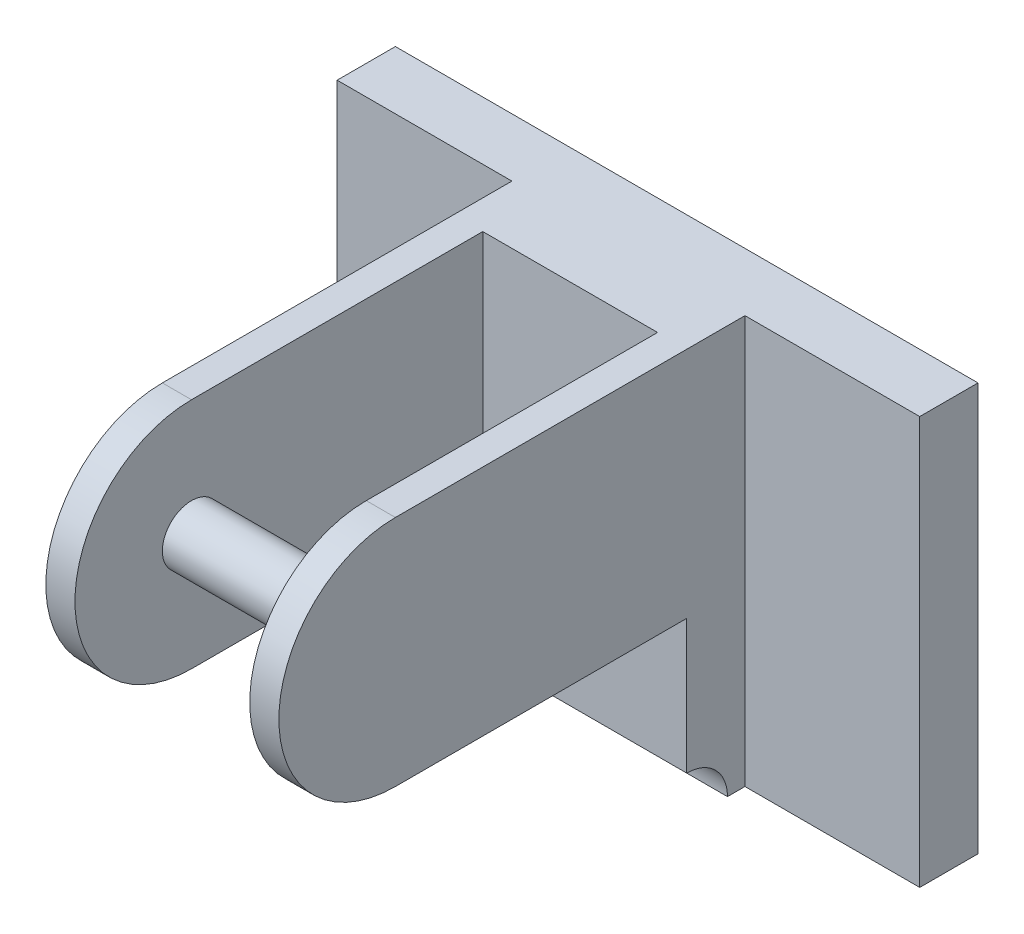
ISO-10303-21;
HEADER;
FILE_DESCRIPTION(('STEP AP214'),'2;1');
FILE_NAME('part.step','',(''),(''),'','','');
FILE_SCHEMA(('AUTOMOTIVE_DESIGN { 1 0 10303 214 1 1 1 1 }'));
ENDSEC;
DATA;
#1=APPLICATION_CONTEXT('core data for automotive mechanical design processes');
#2=APPLICATION_PROTOCOL_DEFINITION('international standard','automotive_design',2000,#1);
#3=PRODUCT_CONTEXT('',#1,'mechanical');
#4=PRODUCT('Part','Part','',(#3));
#5=PRODUCT_RELATED_PRODUCT_CATEGORY('part','',(#4));
#6=PRODUCT_DEFINITION_FORMATION('','',#4);
#7=PRODUCT_DEFINITION_CONTEXT('part definition',#1,'design');
#8=PRODUCT_DEFINITION('design','',#6,#7);
#9=PRODUCT_DEFINITION_SHAPE('','',#8);
#10=(LENGTH_UNIT() NAMED_UNIT(*) SI_UNIT(.MILLI.,.METRE.));
#11=(NAMED_UNIT(*) PLANE_ANGLE_UNIT() SI_UNIT($,.RADIAN.));
#12=(NAMED_UNIT(*) SI_UNIT($,.STERADIAN.) SOLID_ANGLE_UNIT());
#13=UNCERTAINTY_MEASURE_WITH_UNIT(LENGTH_MEASURE(1.E-05),#10,'distance_accuracy_value','');
#14=(GEOMETRIC_REPRESENTATION_CONTEXT(3) GLOBAL_UNCERTAINTY_ASSIGNED_CONTEXT((#13)) GLOBAL_UNIT_ASSIGNED_CONTEXT((#10,
#11,#12)) REPRESENTATION_CONTEXT('',''));
#15=CARTESIAN_POINT('',(0.,0.,0.));
#16=DIRECTION('',(0.,0.,1.));
#17=DIRECTION('',(1.,0.,0.));
#18=AXIS2_PLACEMENT_3D('',#15,#16,#17);
#19=CARTESIAN_POINT('',(0.,0.,10.));
#20=DIRECTION('',(0.,0.,-1.));
#21=DIRECTION('',(-1.,0.,0.));
#22=AXIS2_PLACEMENT_3D('',#19,#20,#21);
#23=PLANE('',#22);
#24=DIRECTION('',(0.,-1.,0.));
#25=VECTOR('',#24,1.);
#26=CARTESIAN_POINT('',(-20.,-35.,10.));
#27=LINE('',#26,#25);
#28=CARTESIAN_POINT('',(-20.,35.,10.));
#29=VERTEX_POINT('',#28);
#30=CARTESIAN_POINT('',(-20.,-35.,10.));
#31=VERTEX_POINT('',#30);
#32=EDGE_CURVE('E203',#29,#31,#27,.T.);
#33=ORIENTED_EDGE('',*,*,#32,.F.);
#34=DIRECTION('',(-1.,0.,0.));
#35=VECTOR('',#34,1.);
#36=CARTESIAN_POINT('',(50.,35.,10.));
#37=LINE('',#36,#35);
#38=CARTESIAN_POINT('',(-50.,35.,10.));
#39=VERTEX_POINT('',#38);
#40=EDGE_CURVE('E235',#29,#39,#37,.T.);
#41=ORIENTED_EDGE('',*,*,#40,.T.);
#42=DIRECTION('',(0.,-1.,0.));
#43=VECTOR('',#42,1.);
#44=CARTESIAN_POINT('',(-50.,35.,10.));
#45=LINE('',#44,#43);
#46=CARTESIAN_POINT('',(-50.,-35.,10.));
#47=VERTEX_POINT('',#46);
#48=EDGE_CURVE('E225',#39,#47,#45,.T.);
#49=ORIENTED_EDGE('',*,*,#48,.T.);
#50=DIRECTION('',(1.,0.,0.));
#51=VECTOR('',#50,1.);
#52=CARTESIAN_POINT('',(50.,-35.,10.));
#53=LINE('',#52,#51);
#54=EDGE_CURVE('E230',#47,#31,#53,.T.);
#55=ORIENTED_EDGE('',*,*,#54,.T.);
#56=EDGE_LOOP('',(#33,#41,#49,#55));
#57=FACE_BOUND('',#56,.T.);
#58=ADVANCED_FACE('F33',(#57),#23,.F.);
#59=DIRECTION('',(0.,1.,0.));
#60=VECTOR('',#59,1.);
#61=CARTESIAN_POINT('',(20.,-35.,10.));
#62=LINE('',#61,#60);
#63=CARTESIAN_POINT('',(20.,-35.,10.));
#64=VERTEX_POINT('',#63);
#65=CARTESIAN_POINT('',(20.,35.,10.));
#66=VERTEX_POINT('',#65);
#67=EDGE_CURVE('E207',#64,#66,#62,.T.);
#68=ORIENTED_EDGE('',*,*,#67,.F.);
#69=CARTESIAN_POINT('',(50.,-35.,10.));
#70=VERTEX_POINT('',#69);
#71=EDGE_CURVE('E228',#64,#70,#53,.T.);
#72=ORIENTED_EDGE('',*,*,#71,.T.);
#73=DIRECTION('',(0.,1.,0.));
#74=VECTOR('',#73,1.);
#75=CARTESIAN_POINT('',(50.,35.,10.));
#76=LINE('',#75,#74);
#77=CARTESIAN_POINT('',(50.,35.,10.));
#78=VERTEX_POINT('',#77);
#79=EDGE_CURVE('E233',#70,#78,#76,.T.);
#80=ORIENTED_EDGE('',*,*,#79,.T.);
#81=EDGE_CURVE('E236',#78,#66,#37,.T.);
#82=ORIENTED_EDGE('',*,*,#81,.T.);
#83=EDGE_LOOP('',(#68,#72,#80,#82));
#84=FACE_BOUND('',#83,.T.);
#85=ADVANCED_FACE('F274',(#84),#23,.F.);
#86=CARTESIAN_POINT('',(-50.,35.,10.));
#87=DIRECTION('',(1.,0.,0.));
#88=DIRECTION('',(0.,1.,0.));
#89=AXIS2_PLACEMENT_3D('',#86,#87,#88);
#90=PLANE('',#89);
#91=DIRECTION('',(0.,-1.,0.));
#92=VECTOR('',#91,1.);
#93=CARTESIAN_POINT('',(-50.,35.,0.));
#94=LINE('',#93,#92);
#95=CARTESIAN_POINT('',(-50.,35.,0.));
#96=VERTEX_POINT('',#95);
#97=CARTESIAN_POINT('',(-50.,-35.,0.));
#98=VERTEX_POINT('',#97);
#99=EDGE_CURVE('E224',#96,#98,#94,.T.);
#100=ORIENTED_EDGE('',*,*,#99,.T.);
#101=DIRECTION('',(0.,0.,-1.));
#102=VECTOR('',#101,1.);
#103=CARTESIAN_POINT('',(-50.,-35.,10.));
#104=LINE('',#103,#102);
#105=EDGE_CURVE('E254',#47,#98,#104,.T.);
#106=ORIENTED_EDGE('',*,*,#105,.F.);
#107=ORIENTED_EDGE('',*,*,#48,.F.);
#108=DIRECTION('',(0.,0.,-1.));
#109=VECTOR('',#108,1.);
#110=CARTESIAN_POINT('',(-50.,35.,10.));
#111=LINE('',#110,#109);
#112=EDGE_CURVE('E238',#39,#96,#111,.T.);
#113=ORIENTED_EDGE('',*,*,#112,.T.);
#114=EDGE_LOOP('',(#100,#106,#107,#113));
#115=FACE_BOUND('',#114,.T.);
#116=ADVANCED_FACE('F35',(#115),#90,.F.);
#117=CARTESIAN_POINT('',(50.,-35.,10.));
#118=DIRECTION('',(0.,1.,0.));
#119=DIRECTION('',(-1.,0.,0.));
#120=AXIS2_PLACEMENT_3D('',#117,#118,#119);
#121=PLANE('',#120);
#122=DIRECTION('',(0.,0.,-1.));
#123=VECTOR('',#122,1.);
#124=CARTESIAN_POINT('',(20.,-35.,20.));
#125=LINE('',#124,#123);
#126=CARTESIAN_POINT('',(20.,-35.,13.));
#127=VERTEX_POINT('',#126);
#128=EDGE_CURVE('E220',#127,#64,#125,.T.);
#129=ORIENTED_EDGE('',*,*,#128,.F.);
#130=DIRECTION('',(1.,0.,0.));
#131=VECTOR('',#130,1.);
#132=CARTESIAN_POINT('',(-50.,-35.,13.));
#133=LINE('',#132,#131);
#134=CARTESIAN_POINT('',(-20.,-35.,13.));
#135=VERTEX_POINT('',#134);
#136=EDGE_CURVE('E198',#135,#127,#133,.T.);
#137=ORIENTED_EDGE('',*,*,#136,.F.);
#138=DIRECTION('',(0.,0.,-1.));
#139=VECTOR('',#138,1.);
#140=CARTESIAN_POINT('',(-20.,-35.,20.));
#141=LINE('',#140,#139);
#142=EDGE_CURVE('E222',#135,#31,#141,.T.);
#143=ORIENTED_EDGE('',*,*,#142,.T.);
#144=ORIENTED_EDGE('',*,*,#54,.F.);
#145=ORIENTED_EDGE('',*,*,#105,.T.);
#146=DIRECTION('',(1.,0.,0.));
#147=VECTOR('',#146,1.);
#148=CARTESIAN_POINT('',(50.,-35.,0.));
#149=LINE('',#148,#147);
#150=CARTESIAN_POINT('',(50.,-35.,0.));
#151=VERTEX_POINT('',#150);
#152=EDGE_CURVE('E241',#98,#151,#149,.T.);
#153=ORIENTED_EDGE('',*,*,#152,.T.);
#154=DIRECTION('',(0.,0.,-1.));
#155=VECTOR('',#154,1.);
#156=CARTESIAN_POINT('',(50.,-35.,10.));
#157=LINE('',#156,#155);
#158=EDGE_CURVE('E251',#70,#151,#157,.T.);
#159=ORIENTED_EDGE('',*,*,#158,.F.);
#160=ORIENTED_EDGE('',*,*,#71,.F.);
#161=EDGE_LOOP('',(#129,#137,#143,#144,#145,#153,#159,#160));
#162=FACE_BOUND('',#161,.T.);
#163=ADVANCED_FACE('F295',(#162),#121,.F.);
#164=CARTESIAN_POINT('',(50.,35.,10.));
#165=DIRECTION('',(-1.,0.,0.));
#166=DIRECTION('',(0.,-1.,0.));
#167=AXIS2_PLACEMENT_3D('',#164,#165,#166);
#168=PLANE('',#167);
#169=DIRECTION('',(0.,1.,0.));
#170=VECTOR('',#169,1.);
#171=CARTESIAN_POINT('',(50.,35.,0.));
#172=LINE('',#171,#170);
#173=CARTESIAN_POINT('',(50.,35.,0.));
#174=VERTEX_POINT('',#173);
#175=EDGE_CURVE('E243',#151,#174,#172,.T.);
#176=ORIENTED_EDGE('',*,*,#175,.T.);
#177=DIRECTION('',(0.,0.,-1.));
#178=VECTOR('',#177,1.);
#179=CARTESIAN_POINT('',(50.,35.,10.));
#180=LINE('',#179,#178);
#181=EDGE_CURVE('E248',#78,#174,#180,.T.);
#182=ORIENTED_EDGE('',*,*,#181,.F.);
#183=ORIENTED_EDGE('',*,*,#79,.F.);
#184=ORIENTED_EDGE('',*,*,#158,.T.);
#185=EDGE_LOOP('',(#176,#182,#183,#184));
#186=FACE_BOUND('',#185,.T.);
#187=ADVANCED_FACE('F292',(#186),#168,.F.);
#188=CARTESIAN_POINT('',(50.,35.,10.));
#189=DIRECTION('',(0.,-1.,0.));
#190=DIRECTION('',(1.,0.,0.));
#191=AXIS2_PLACEMENT_3D('',#188,#189,#190);
#192=PLANE('',#191);
#193=DIRECTION('',(-1.,0.,0.));
#194=VECTOR('',#193,1.);
#195=CARTESIAN_POINT('',(50.,35.,0.));
#196=LINE('',#195,#194);
#197=EDGE_CURVE('E229',#174,#96,#196,.T.);
#198=ORIENTED_EDGE('',*,*,#197,.T.);
#199=ORIENTED_EDGE('',*,*,#112,.F.);
#200=ORIENTED_EDGE('',*,*,#40,.F.);
#201=DIRECTION('',(0.,0.,-1.));
#202=VECTOR('',#201,1.);
#203=CARTESIAN_POINT('',(-20.,35.,20.));
#204=LINE('',#203,#202);
#205=CARTESIAN_POINT('',(-20.,35.,70.));
#206=VERTEX_POINT('',#205);
#207=EDGE_CURVE('E210',#206,#29,#204,.T.);
#208=ORIENTED_EDGE('',*,*,#207,.F.);
#209=DIRECTION('',(-1.,0.,0.));
#210=VECTOR('',#209,1.);
#211=CARTESIAN_POINT('',(-15.,35.,70.));
#212=LINE('',#211,#210);
#213=CARTESIAN_POINT('',(-15.,35.,70.));
#214=VERTEX_POINT('',#213);
#215=EDGE_CURVE('E150',#214,#206,#212,.T.);
#216=ORIENTED_EDGE('',*,*,#215,.F.);
#217=DIRECTION('',(0.,0.,1.));
#218=VECTOR('',#217,1.);
#219=CARTESIAN_POINT('',(-15.,35.,0.));
#220=LINE('',#219,#218);
#221=CARTESIAN_POINT('',(-15.,35.,20.));
#222=VERTEX_POINT('',#221);
#223=EDGE_CURVE('E157',#222,#214,#220,.T.);
#224=ORIENTED_EDGE('',*,*,#223,.F.);
#225=DIRECTION('',(-1.,0.,0.));
#226=VECTOR('',#225,1.);
#227=CARTESIAN_POINT('',(20.,35.,20.));
#228=LINE('',#227,#226);
#229=CARTESIAN_POINT('',(15.,35.,20.));
#230=VERTEX_POINT('',#229);
#231=EDGE_CURVE('E53',#230,#222,#228,.T.);
#232=ORIENTED_EDGE('',*,*,#231,.F.);
#233=DIRECTION('',(0.,0.,1.));
#234=VECTOR('',#233,1.);
#235=CARTESIAN_POINT('',(15.,35.,0.));
#236=LINE('',#235,#234);
#237=CARTESIAN_POINT('',(15.,35.,70.));
#238=VERTEX_POINT('',#237);
#239=EDGE_CURVE('E172',#230,#238,#236,.T.);
#240=ORIENTED_EDGE('',*,*,#239,.T.);
#241=DIRECTION('',(1.,0.,0.));
#242=VECTOR('',#241,1.);
#243=CARTESIAN_POINT('',(15.,35.,70.));
#244=LINE('',#243,#242);
#245=CARTESIAN_POINT('',(20.,35.,70.));
#246=VERTEX_POINT('',#245);
#247=EDGE_CURVE('E184',#238,#246,#244,.T.);
#248=ORIENTED_EDGE('',*,*,#247,.T.);
#249=DIRECTION('',(0.,0.,-1.));
#250=VECTOR('',#249,1.);
#251=CARTESIAN_POINT('',(20.,35.,20.));
#252=LINE('',#251,#250);
#253=EDGE_CURVE('E217',#246,#66,#252,.T.);
#254=ORIENTED_EDGE('',*,*,#253,.T.);
#255=ORIENTED_EDGE('',*,*,#81,.F.);
#256=ORIENTED_EDGE('',*,*,#181,.T.);
#257=EDGE_LOOP('',(#198,#199,#200,#208,#216,#224,#232,#240,#248,#254,#255,#256));
#258=FACE_BOUND('',#257,.T.);
#259=ADVANCED_FACE('F288',(#258),#192,.F.);
#260=CARTESIAN_POINT('',(0.,0.,0.));
#261=DIRECTION('',(0.,0.,-1.));
#262=DIRECTION('',(-1.,0.,0.));
#263=AXIS2_PLACEMENT_3D('',#260,#261,#262);
#264=PLANE('',#263);
#265=ORIENTED_EDGE('',*,*,#99,.F.);
#266=ORIENTED_EDGE('',*,*,#197,.F.);
#267=ORIENTED_EDGE('',*,*,#175,.F.);
#268=ORIENTED_EDGE('',*,*,#152,.F.);
#269=EDGE_LOOP('',(#265,#266,#267,#268));
#270=FACE_BOUND('',#269,.T.);
#271=ADVANCED_FACE('F285',(#270),#264,.T.);
#272=CARTESIAN_POINT('',(-20.,-35.,20.));
#273=DIRECTION('',(1.,0.,0.));
#274=DIRECTION('',(0.,0.,-1.));
#275=AXIS2_PLACEMENT_3D('',#272,#273,#274);
#276=PLANE('',#275);
#277=ORIENTED_EDGE('',*,*,#142,.F.);
#278=CARTESIAN_POINT('',(-20.,-35.,20.));
#279=DIRECTION('',(1.,0.,0.));
#280=DIRECTION('',(0.,0.,-1.));
#281=AXIS2_PLACEMENT_3D('',#278,#279,#280);
#282=CIRCLE('',#281,7.);
#283=CARTESIAN_POINT('',(-20.,-28.,20.));
#284=VERTEX_POINT('',#283);
#285=EDGE_CURVE('E200',#135,#284,#282,.T.);
#286=ORIENTED_EDGE('',*,*,#285,.T.);
#287=DIRECTION('',(0.,-1.,0.));
#288=VECTOR('',#287,1.);
#289=CARTESIAN_POINT('',(-20.,-35.,20.));
#290=LINE('',#289,#288);
#291=CARTESIAN_POINT('',(-20.,-4.99999999999999,20.));
#292=VERTEX_POINT('',#291);
#293=EDGE_CURVE('E204',#292,#284,#290,.T.);
#294=ORIENTED_EDGE('',*,*,#293,.F.);
#295=DIRECTION('',(0.,0.,1.));
#296=VECTOR('',#295,1.);
#297=CARTESIAN_POINT('',(-20.,-4.99999999999999,0.));
#298=LINE('',#297,#296);
#299=CARTESIAN_POINT('',(-20.,-4.99999999999999,70.));
#300=VERTEX_POINT('',#299);
#301=EDGE_CURVE('E163',#292,#300,#298,.T.);
#302=ORIENTED_EDGE('',*,*,#301,.T.);
#303=CARTESIAN_POINT('',(-20.,15.,70.));
#304=DIRECTION('',(-1.,0.,0.));
#305=DIRECTION('',(0.,0.,1.));
#306=AXIS2_PLACEMENT_3D('',#303,#304,#305);
#307=CIRCLE('',#306,20.);
#308=EDGE_CURVE('E145',#300,#206,#307,.T.);
#309=ORIENTED_EDGE('',*,*,#308,.T.);
#310=ORIENTED_EDGE('',*,*,#207,.T.);
#311=ORIENTED_EDGE('',*,*,#32,.T.);
#312=EDGE_LOOP('',(#277,#286,#294,#302,#309,#310,#311));
#313=FACE_BOUND('',#312,.T.);
#314=ADVANCED_FACE('F283',(#313),#276,.F.);
#315=CARTESIAN_POINT('',(20.,-35.,20.));
#316=DIRECTION('',(-1.,0.,0.));
#317=DIRECTION('',(0.,0.,1.));
#318=AXIS2_PLACEMENT_3D('',#315,#316,#317);
#319=PLANE('',#318);
#320=DIRECTION('',(0.,1.,0.));
#321=VECTOR('',#320,1.);
#322=CARTESIAN_POINT('',(20.,-35.,20.));
#323=LINE('',#322,#321);
#324=CARTESIAN_POINT('',(20.,-28.,20.));
#325=VERTEX_POINT('',#324);
#326=CARTESIAN_POINT('',(20.,-4.99999999999999,20.));
#327=VERTEX_POINT('',#326);
#328=EDGE_CURVE('E206',#325,#327,#323,.T.);
#329=ORIENTED_EDGE('',*,*,#328,.F.);
#330=CARTESIAN_POINT('',(20.,-35.,20.));
#331=DIRECTION('',(1.,0.,0.));
#332=DIRECTION('',(0.,0.,1.));
#333=AXIS2_PLACEMENT_3D('',#330,#331,#332);
#334=CIRCLE('',#333,7.);
#335=EDGE_CURVE('E192',#127,#325,#334,.T.);
#336=ORIENTED_EDGE('',*,*,#335,.F.);
#337=ORIENTED_EDGE('',*,*,#128,.T.);
#338=ORIENTED_EDGE('',*,*,#67,.T.);
#339=ORIENTED_EDGE('',*,*,#253,.F.);
#340=CARTESIAN_POINT('',(20.,15.,70.));
#341=DIRECTION('',(1.,0.,0.));
#342=DIRECTION('',(0.,0.,-1.));
#343=AXIS2_PLACEMENT_3D('',#340,#341,#342);
#344=CIRCLE('',#343,20.);
#345=CARTESIAN_POINT('',(20.,-5.,70.));
#346=VERTEX_POINT('',#345);
#347=EDGE_CURVE('E170',#246,#346,#344,.T.);
#348=ORIENTED_EDGE('',*,*,#347,.T.);
#349=DIRECTION('',(0.,0.,1.));
#350=VECTOR('',#349,1.);
#351=CARTESIAN_POINT('',(20.,-4.99999999999999,0.));
#352=LINE('',#351,#350);
#353=EDGE_CURVE('E176',#327,#346,#352,.T.);
#354=ORIENTED_EDGE('',*,*,#353,.F.);
#355=EDGE_LOOP('',(#329,#336,#337,#338,#339,#348,#354));
#356=FACE_BOUND('',#355,.T.);
#357=ADVANCED_FACE('F312',(#356),#319,.F.);
#358=CARTESIAN_POINT('',(0.,0.,20.));
#359=DIRECTION('',(0.,0.,1.));
#360=DIRECTION('',(1.,0.,0.));
#361=AXIS2_PLACEMENT_3D('',#358,#359,#360);
#362=PLANE('',#361);
#363=DIRECTION('',(-1.,0.,0.));
#364=VECTOR('',#363,1.);
#365=CARTESIAN_POINT('',(-15.,-4.99999999999999,20.));
#366=LINE('',#365,#364);
#367=CARTESIAN_POINT('',(-15.,-4.99999999999999,20.));
#368=VERTEX_POINT('',#367);
#369=EDGE_CURVE('E161',#368,#292,#366,.T.);
#370=ORIENTED_EDGE('',*,*,#369,.T.);
#371=ORIENTED_EDGE('',*,*,#293,.T.);
#372=DIRECTION('',(1.,0.,0.));
#373=VECTOR('',#372,1.);
#374=CARTESIAN_POINT('',(-50.,-28.,20.));
#375=LINE('',#374,#373);
#376=EDGE_CURVE('E257',#325,#284,#375,.F.);
#377=ORIENTED_EDGE('',*,*,#376,.F.);
#378=ORIENTED_EDGE('',*,*,#328,.T.);
#379=DIRECTION('',(1.,0.,0.));
#380=VECTOR('',#379,1.);
#381=CARTESIAN_POINT('',(15.,-4.99999999999999,20.));
#382=LINE('',#381,#380);
#383=CARTESIAN_POINT('',(15.,-4.99999999999999,20.));
#384=VERTEX_POINT('',#383);
#385=EDGE_CURVE('E189',#384,#327,#382,.T.);
#386=ORIENTED_EDGE('',*,*,#385,.F.);
#387=DIRECTION('',(0.,-1.,0.));
#388=VECTOR('',#387,1.);
#389=CARTESIAN_POINT('',(15.,0.,20.));
#390=LINE('',#389,#388);
#391=EDGE_CURVE('E181',#230,#384,#390,.T.);
#392=ORIENTED_EDGE('',*,*,#391,.F.);
#393=ORIENTED_EDGE('',*,*,#231,.T.);
#394=DIRECTION('',(0.,1.,0.));
#395=VECTOR('',#394,1.);
#396=CARTESIAN_POINT('',(-15.,0.,20.));
#397=LINE('',#396,#395);
#398=EDGE_CURVE('E48',#368,#222,#397,.T.);
#399=ORIENTED_EDGE('',*,*,#398,.F.);
#400=EDGE_LOOP('',(#370,#371,#377,#378,#386,#392,#393,#399));
#401=FACE_BOUND('',#400,.T.);
#402=ADVANCED_FACE('F326',(#401),#362,.T.);
#403=CARTESIAN_POINT('',(-50.,-35.,20.));
#404=DIRECTION('',(1.,0.,0.));
#405=DIRECTION('',(0.,0.,-1.));
#406=AXIS2_PLACEMENT_3D('',#403,#404,#405);
#407=CYLINDRICAL_SURFACE('',#406,7.);
#408=ORIENTED_EDGE('',*,*,#136,.T.);
#409=ORIENTED_EDGE('',*,*,#335,.T.);
#410=ORIENTED_EDGE('',*,*,#376,.T.);
#411=ORIENTED_EDGE('',*,*,#285,.F.);
#412=EDGE_LOOP('',(#408,#409,#410,#411));
#413=FACE_BOUND('',#412,.T.);
#414=ADVANCED_FACE('F334',(#413),#407,.F.);
#415=CARTESIAN_POINT('',(15.,-4.99999999999999,0.));
#416=DIRECTION('',(0.,1.,0.));
#417=DIRECTION('',(0.,0.,1.));
#418=AXIS2_PLACEMENT_3D('',#415,#416,#417);
#419=PLANE('',#418);
#420=ORIENTED_EDGE('',*,*,#353,.T.);
#421=DIRECTION('',(1.,0.,0.));
#422=VECTOR('',#421,1.);
#423=CARTESIAN_POINT('',(15.,-5.,70.));
#424=LINE('',#423,#422);
#425=CARTESIAN_POINT('',(15.,-5.,70.));
#426=VERTEX_POINT('',#425);
#427=EDGE_CURVE('E193',#426,#346,#424,.T.);
#428=ORIENTED_EDGE('',*,*,#427,.F.);
#429=DIRECTION('',(0.,0.,1.));
#430=VECTOR('',#429,1.);
#431=CARTESIAN_POINT('',(15.,-4.99999999999999,0.));
#432=LINE('',#431,#430);
#433=EDGE_CURVE('E179',#384,#426,#432,.T.);
#434=ORIENTED_EDGE('',*,*,#433,.F.);
#435=ORIENTED_EDGE('',*,*,#385,.T.);
#436=EDGE_LOOP('',(#420,#428,#434,#435));
#437=FACE_BOUND('',#436,.T.);
#438=ADVANCED_FACE('F325',(#437),#419,.F.);
#439=CARTESIAN_POINT('',(15.,15.,70.));
#440=DIRECTION('',(1.,0.,0.));
#441=DIRECTION('',(0.,0.,-1.));
#442=AXIS2_PLACEMENT_3D('',#439,#440,#441);
#443=CYLINDRICAL_SURFACE('',#442,20.);
#444=ORIENTED_EDGE('',*,*,#347,.F.);
#445=ORIENTED_EDGE('',*,*,#247,.F.);
#446=CARTESIAN_POINT('',(15.,15.,70.));
#447=DIRECTION('',(1.,0.,0.));
#448=DIRECTION('',(0.,0.,-1.));
#449=AXIS2_PLACEMENT_3D('',#446,#447,#448);
#450=CIRCLE('',#449,20.);
#451=EDGE_CURVE('E175',#238,#426,#450,.T.);
#452=ORIENTED_EDGE('',*,*,#451,.T.);
#453=ORIENTED_EDGE('',*,*,#427,.T.);
#454=EDGE_LOOP('',(#444,#445,#452,#453));
#455=FACE_BOUND('',#454,.T.);
#456=ADVANCED_FACE('F320',(#455),#443,.T.);
#457=CARTESIAN_POINT('',(15.,0.,0.));
#458=DIRECTION('',(1.,0.,0.));
#459=DIRECTION('',(0.,0.,-1.));
#460=AXIS2_PLACEMENT_3D('',#457,#458,#459);
#461=PLANE('',#460);
#462=CARTESIAN_POINT('',(15.,15.,70.));
#463=DIRECTION('',(1.,0.,0.));
#464=DIRECTION('',(0.,0.,-1.));
#465=AXIS2_PLACEMENT_3D('',#462,#463,#464);
#466=CIRCLE('',#465,5.);
#467=CARTESIAN_POINT('',(15.,15.,65.));
#468=VERTEX_POINT('',#467);
#469=EDGE_CURVE('E11',#468,#468,#466,.F.);
#470=ORIENTED_EDGE('',*,*,#469,.F.);
#471=EDGE_LOOP('',(#470));
#472=FACE_BOUND('',#471,.T.);
#473=ORIENTED_EDGE('',*,*,#239,.F.);
#474=ORIENTED_EDGE('',*,*,#391,.T.);
#475=ORIENTED_EDGE('',*,*,#433,.T.);
#476=ORIENTED_EDGE('',*,*,#451,.F.);
#477=EDGE_LOOP('',(#473,#474,#475,#476));
#478=FACE_BOUND('',#477,.T.);
#479=ADVANCED_FACE('F330',(#472,#478),#461,.F.);
#480=CARTESIAN_POINT('',(-15.,-4.99999999999999,0.));
#481=DIRECTION('',(0.,-1.,0.));
#482=DIRECTION('',(0.,0.,-1.));
#483=AXIS2_PLACEMENT_3D('',#480,#481,#482);
#484=PLANE('',#483);
#485=ORIENTED_EDGE('',*,*,#301,.F.);
#486=ORIENTED_EDGE('',*,*,#369,.F.);
#487=DIRECTION('',(0.,0.,1.));
#488=VECTOR('',#487,1.);
#489=CARTESIAN_POINT('',(-15.,-4.99999999999999,0.));
#490=LINE('',#489,#488);
#491=CARTESIAN_POINT('',(-15.,-4.99999999999999,70.));
#492=VERTEX_POINT('',#491);
#493=EDGE_CURVE('E155',#368,#492,#490,.T.);
#494=ORIENTED_EDGE('',*,*,#493,.T.);
#495=DIRECTION('',(-1.,0.,0.));
#496=VECTOR('',#495,1.);
#497=CARTESIAN_POINT('',(-15.,-4.99999999999999,70.));
#498=LINE('',#497,#496);
#499=EDGE_CURVE('E139',#492,#300,#498,.T.);
#500=ORIENTED_EDGE('',*,*,#499,.T.);
#501=EDGE_LOOP('',(#485,#486,#494,#500));
#502=FACE_BOUND('',#501,.T.);
#503=ADVANCED_FACE('F160',(#502),#484,.T.);
#504=CARTESIAN_POINT('',(-15.,15.,70.));
#505=DIRECTION('',(-1.,0.,0.));
#506=DIRECTION('',(0.,0.,1.));
#507=AXIS2_PLACEMENT_3D('',#504,#505,#506);
#508=CYLINDRICAL_SURFACE('',#507,20.);
#509=ORIENTED_EDGE('',*,*,#308,.F.);
#510=ORIENTED_EDGE('',*,*,#499,.F.);
#511=CARTESIAN_POINT('',(-15.,15.,70.));
#512=DIRECTION('',(-1.,0.,0.));
#513=DIRECTION('',(0.,0.,1.));
#514=AXIS2_PLACEMENT_3D('',#511,#512,#513);
#515=CIRCLE('',#514,20.);
#516=EDGE_CURVE('E143',#492,#214,#515,.T.);
#517=ORIENTED_EDGE('',*,*,#516,.T.);
#518=ORIENTED_EDGE('',*,*,#215,.T.);
#519=EDGE_LOOP('',(#509,#510,#517,#518));
#520=FACE_BOUND('',#519,.T.);
#521=ADVANCED_FACE('F141',(#520),#508,.T.);
#522=CARTESIAN_POINT('',(-15.,0.,0.));
#523=DIRECTION('',(-1.,0.,0.));
#524=DIRECTION('',(0.,0.,1.));
#525=AXIS2_PLACEMENT_3D('',#522,#523,#524);
#526=PLANE('',#525);
#527=CARTESIAN_POINT('',(-15.,15.,70.));
#528=DIRECTION('',(-1.,0.,0.));
#529=DIRECTION('',(0.,0.,1.));
#530=AXIS2_PLACEMENT_3D('',#527,#528,#529);
#531=CIRCLE('',#530,5.);
#532=CARTESIAN_POINT('',(-15.,15.,75.));
#533=VERTEX_POINT('',#532);
#534=EDGE_CURVE('E41',#533,#533,#531,.F.);
#535=ORIENTED_EDGE('',*,*,#534,.F.);
#536=EDGE_LOOP('',(#535));
#537=FACE_BOUND('',#536,.T.);
#538=ORIENTED_EDGE('',*,*,#493,.F.);
#539=ORIENTED_EDGE('',*,*,#398,.T.);
#540=ORIENTED_EDGE('',*,*,#223,.T.);
#541=ORIENTED_EDGE('',*,*,#516,.F.);
#542=EDGE_LOOP('',(#538,#539,#540,#541));
#543=FACE_BOUND('',#542,.T.);
#544=ADVANCED_FACE('F154',(#537,#543),#526,.F.);
#545=CARTESIAN_POINT('',(29.142135623731,15.,70.));
#546=DIRECTION('',(-1.,0.,0.));
#547=DIRECTION('',(0.,0.,1.));
#548=AXIS2_PLACEMENT_3D('',#545,#546,#547);
#549=CYLINDRICAL_SURFACE('',#548,5.);
#550=ORIENTED_EDGE('',*,*,#534,.T.);
#551=EDGE_LOOP('',(#550));
#552=FACE_BOUND('',#551,.T.);
#553=ORIENTED_EDGE('',*,*,#469,.T.);
#554=EDGE_LOOP('',(#553));
#555=FACE_BOUND('',#554,.T.);
#556=ADVANCED_FACE('F262',(#552,#555),#549,.T.);
#557=CLOSED_SHELL('',(#58,#85,#116,#163,#187,#259,#271,#314,#357,#402,#414,#438,#456,#479,#503,
#521,#544,#556));
#558=MANIFOLD_SOLID_BREP('B2',#557);
#559=ADVANCED_BREP_SHAPE_REPRESENTATION('',(#18,#558),#14);
#560=SHAPE_DEFINITION_REPRESENTATION(#9,#559);
ENDSEC;
END-ISO-10303-21;
